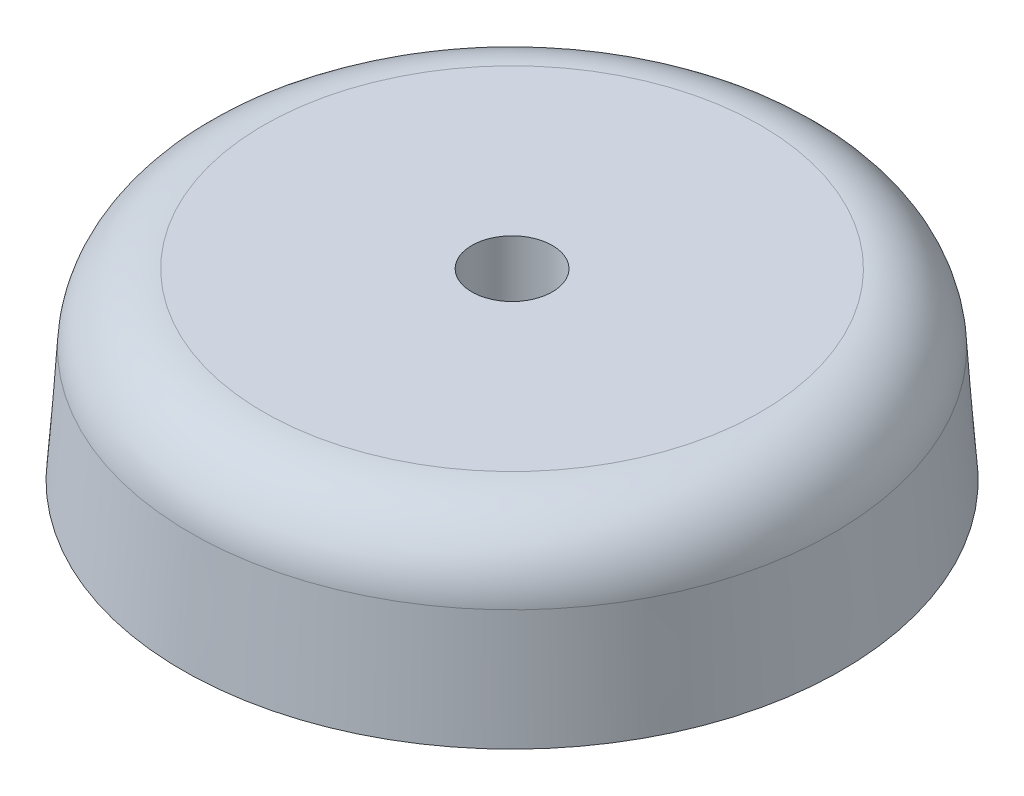
ISO-10303-21;
HEADER;
FILE_DESCRIPTION(('STEP AP214'),'2;1');
FILE_NAME('part.step','',(''),(''),'','','');
FILE_SCHEMA(('AUTOMOTIVE_DESIGN { 1 0 10303 214 1 1 1 1 }'));
ENDSEC;
DATA;
#1=APPLICATION_CONTEXT('core data for automotive mechanical design processes');
#2=APPLICATION_PROTOCOL_DEFINITION('international standard','automotive_design',2000,#1);
#3=PRODUCT_CONTEXT('',#1,'mechanical');
#4=PRODUCT('Part','Part','',(#3));
#5=PRODUCT_RELATED_PRODUCT_CATEGORY('part','',(#4));
#6=PRODUCT_DEFINITION_FORMATION('','',#4);
#7=PRODUCT_DEFINITION_CONTEXT('part definition',#1,'design');
#8=PRODUCT_DEFINITION('design','',#6,#7);
#9=PRODUCT_DEFINITION_SHAPE('','',#8);
#10=(LENGTH_UNIT() NAMED_UNIT(*) SI_UNIT(.MILLI.,.METRE.));
#11=(NAMED_UNIT(*) PLANE_ANGLE_UNIT() SI_UNIT($,.RADIAN.));
#12=(NAMED_UNIT(*) SI_UNIT($,.STERADIAN.) SOLID_ANGLE_UNIT());
#13=UNCERTAINTY_MEASURE_WITH_UNIT(LENGTH_MEASURE(1.E-05),#10,'distance_accuracy_value','');
#14=(GEOMETRIC_REPRESENTATION_CONTEXT(3) GLOBAL_UNCERTAINTY_ASSIGNED_CONTEXT((#13)) GLOBAL_UNIT_ASSIGNED_CONTEXT((#10,
#11,#12)) REPRESENTATION_CONTEXT('',''));
#15=CARTESIAN_POINT('',(0.,0.,0.));
#16=DIRECTION('',(0.,0.,1.));
#17=DIRECTION('',(1.,0.,0.));
#18=AXIS2_PLACEMENT_3D('',#15,#16,#17);
#19=CARTESIAN_POINT('',(0.,3.,0.));
#20=DIRECTION('',(0.,-1.,0.));
#21=DIRECTION('',(0.,0.,-1.));
#22=AXIS2_PLACEMENT_3D('',#19,#20,#21);
#23=TOROIDAL_SURFACE('',#22,6.78533576800713,2.);
#24=CARTESIAN_POINT('',(0.,3.13951294748823,0.));
#25=DIRECTION('',(0.,-1.,0.));
#26=DIRECTION('',(0.,0.,-1.));
#27=AXIS2_PLACEMENT_3D('',#24,#25,#26);
#28=CIRCLE('',#27,8.78046386852678);
#29=CARTESIAN_POINT('',(0.,3.13951294748823,-8.78046386852678));
#30=VERTEX_POINT('',#29);
#31=EDGE_CURVE('E57',#30,#30,#28,.T.);
#32=ORIENTED_EDGE('',*,*,#31,.F.);
#33=EDGE_LOOP('',(#32));
#34=FACE_BOUND('',#33,.T.);
#35=CARTESIAN_POINT('',(0.,5.,0.));
#36=DIRECTION('',(0.,-1.,0.));
#37=DIRECTION('',(0.,0.,-1.));
#38=AXIS2_PLACEMENT_3D('',#35,#36,#37);
#39=CIRCLE('',#38,6.78533576800712);
#40=CARTESIAN_POINT('',(0.,5.,-6.78533576800712));
#41=VERTEX_POINT('',#40);
#42=EDGE_CURVE('E10',#41,#41,#39,.T.);
#43=ORIENTED_EDGE('',*,*,#42,.T.);
#44=EDGE_LOOP('',(#43));
#45=FACE_BOUND('',#44,.T.);
#46=ADVANCED_FACE('F32',(#34,#45),#23,.T.);
#47=CARTESIAN_POINT('',(0.,5.,0.));
#48=DIRECTION('',(0.,-1.,0.));
#49=DIRECTION('',(0.,0.,-1.));
#50=AXIS2_PLACEMENT_3D('',#47,#48,#49);
#51=PLANE('',#50);
#52=ORIENTED_EDGE('',*,*,#42,.F.);
#53=EDGE_LOOP('',(#52));
#54=FACE_BOUND('',#53,.T.);
#55=CARTESIAN_POINT('',(0.,5.,0.));
#56=DIRECTION('',(0.,-1.,0.));
#57=DIRECTION('',(0.,0.,-1.));
#58=AXIS2_PLACEMENT_3D('',#55,#56,#57);
#59=CIRCLE('',#58,1.1);
#60=CARTESIAN_POINT('',(0.,5.,-1.1));
#61=VERTEX_POINT('',#60);
#62=EDGE_CURVE('E38',#61,#61,#59,.T.);
#63=ORIENTED_EDGE('',*,*,#62,.T.);
#64=EDGE_LOOP('',(#63));
#65=FACE_BOUND('',#64,.T.);
#66=ADVANCED_FACE('F64',(#54,#65),#51,.F.);
#67=CARTESIAN_POINT('',(0.,0.,0.));
#68=DIRECTION('',(0.,-1.,0.));
#69=DIRECTION('',(0.,0.,-1.));
#70=AXIS2_PLACEMENT_3D('',#67,#68,#69);
#71=CYLINDRICAL_SURFACE('',#70,1.1);
#72=ORIENTED_EDGE('',*,*,#62,.F.);
#73=EDGE_LOOP('',(#72));
#74=FACE_BOUND('',#73,.T.);
#75=CARTESIAN_POINT('',(0.,2.8,0.));
#76=DIRECTION('',(0.,-1.,0.));
#77=DIRECTION('',(0.,0.,-1.));
#78=AXIS2_PLACEMENT_3D('',#75,#76,#77);
#79=CIRCLE('',#78,1.1);
#80=CARTESIAN_POINT('',(0.,2.8,-1.1));
#81=VERTEX_POINT('',#80);
#82=EDGE_CURVE('E42',#81,#81,#79,.T.);
#83=ORIENTED_EDGE('',*,*,#82,.T.);
#84=EDGE_LOOP('',(#83));
#85=FACE_BOUND('',#84,.T.);
#86=ADVANCED_FACE('F68',(#74,#85),#71,.F.);
#87=CARTESIAN_POINT('',(0.,2.8,0.));
#88=DIRECTION('',(0.,1.,0.));
#89=DIRECTION('',(0.,0.,1.));
#90=AXIS2_PLACEMENT_3D('',#87,#88,#89);
#91=PLANE('',#90);
#92=ORIENTED_EDGE('',*,*,#82,.F.);
#93=EDGE_LOOP('',(#92));
#94=FACE_BOUND('',#93,.T.);
#95=CARTESIAN_POINT('',(0.,2.8,0.));
#96=DIRECTION('',(0.,-1.,0.));
#97=DIRECTION('',(0.,0.,-1.));
#98=AXIS2_PLACEMENT_3D('',#95,#96,#97);
#99=CIRCLE('',#98,6.60420492655818);
#100=CARTESIAN_POINT('',(0.,2.8,-6.60420492655818));
#101=VERTEX_POINT('',#100);
#102=EDGE_CURVE('E46',#101,#101,#99,.T.);
#103=ORIENTED_EDGE('',*,*,#102,.T.);
#104=EDGE_LOOP('',(#103));
#105=FACE_BOUND('',#104,.T.);
#106=ADVANCED_FACE('F73',(#94,#105),#91,.F.);
#107=CARTESIAN_POINT('',(0.,0.,0.));
#108=DIRECTION('',(0.,-1.,0.));
#109=DIRECTION('',(0.,0.,-1.));
#110=AXIS2_PLACEMENT_3D('',#107,#108,#109);
#111=CONICAL_SURFACE('',#110,6.8,0.0698131700797695);
#112=ORIENTED_EDGE('',*,*,#102,.F.);
#113=EDGE_LOOP('',(#112));
#114=FACE_BOUND('',#113,.T.);
#115=CARTESIAN_POINT('',(0.,0.,0.));
#116=DIRECTION('',(0.,-1.,0.));
#117=DIRECTION('',(0.,0.,-1.));
#118=AXIS2_PLACEMENT_3D('',#115,#116,#117);
#119=CIRCLE('',#118,6.8);
#120=CARTESIAN_POINT('',(0.,0.,-6.8));
#121=VERTEX_POINT('',#120);
#122=EDGE_CURVE('E51',#121,#121,#119,.T.);
#123=ORIENTED_EDGE('',*,*,#122,.T.);
#124=EDGE_LOOP('',(#123));
#125=FACE_BOUND('',#124,.T.);
#126=ADVANCED_FACE('F79',(#114,#125),#111,.F.);
#127=CARTESIAN_POINT('',(0.,0.,0.));
#128=DIRECTION('',(0.,1.,0.));
#129=DIRECTION('',(0.,0.,1.));
#130=AXIS2_PLACEMENT_3D('',#127,#128,#129);
#131=PLANE('',#130);
#132=ORIENTED_EDGE('',*,*,#122,.F.);
#133=EDGE_LOOP('',(#132));
#134=FACE_BOUND('',#133,.T.);
#135=CARTESIAN_POINT('',(0.,0.,0.));
#136=DIRECTION('',(0.,-1.,0.));
#137=DIRECTION('',(0.,0.,-1.));
#138=AXIS2_PLACEMENT_3D('',#135,#136,#137);
#139=CIRCLE('',#138,9.);
#140=CARTESIAN_POINT('',(0.,0.,-9.));
#141=VERTEX_POINT('',#140);
#142=EDGE_CURVE('E54',#141,#141,#139,.T.);
#143=ORIENTED_EDGE('',*,*,#142,.T.);
#144=EDGE_LOOP('',(#143));
#145=FACE_BOUND('',#144,.T.);
#146=ADVANCED_FACE('F83',(#134,#145),#131,.F.);
#147=CARTESIAN_POINT('',(0.,3.13951294748823,0.));
#148=DIRECTION('',(0.,-1.,0.));
#149=DIRECTION('',(0.,0.,-1.));
#150=AXIS2_PLACEMENT_3D('',#147,#148,#149);
#151=CONICAL_SURFACE('',#150,8.78046386852678,0.0698131700797699);
#152=ORIENTED_EDGE('',*,*,#142,.F.);
#153=EDGE_LOOP('',(#152));
#154=FACE_BOUND('',#153,.T.);
#155=ORIENTED_EDGE('',*,*,#31,.T.);
#156=EDGE_LOOP('',(#155));
#157=FACE_BOUND('',#156,.T.);
#158=ADVANCED_FACE('F61',(#154,#157),#151,.T.);
#159=CLOSED_SHELL('',(#46,#66,#86,#106,#126,#146,#158));
#160=MANIFOLD_SOLID_BREP('B2',#159);
#161=ADVANCED_BREP_SHAPE_REPRESENTATION('',(#18,#160),#14);
#162=SHAPE_DEFINITION_REPRESENTATION(#9,#161);
ENDSEC;
END-ISO-10303-21;
